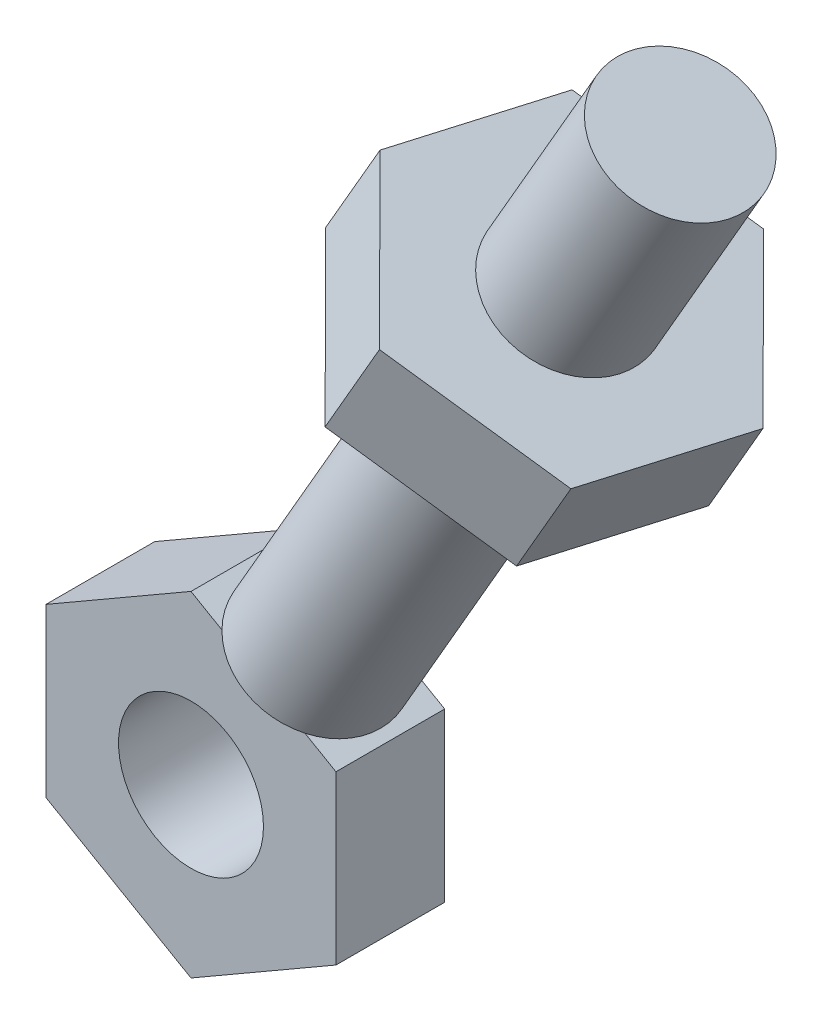
ISO-10303-21;
HEADER;
FILE_DESCRIPTION(('STEP AP214'),'2;1');
FILE_NAME('part.step','',(''),(''),'','','');
FILE_SCHEMA(('AUTOMOTIVE_DESIGN { 1 0 10303 214 1 1 1 1 }'));
ENDSEC;
DATA;
#1=APPLICATION_CONTEXT('core data for automotive mechanical design processes');
#2=APPLICATION_PROTOCOL_DEFINITION('international standard','automotive_design',2000,#1);
#3=PRODUCT_CONTEXT('',#1,'mechanical');
#4=PRODUCT('Part','Part','',(#3));
#5=PRODUCT_RELATED_PRODUCT_CATEGORY('part','',(#4));
#6=PRODUCT_DEFINITION_FORMATION('','',#4);
#7=PRODUCT_DEFINITION_CONTEXT('part definition',#1,'design');
#8=PRODUCT_DEFINITION('design','',#6,#7);
#9=PRODUCT_DEFINITION_SHAPE('','',#8);
#10=(LENGTH_UNIT() NAMED_UNIT(*) SI_UNIT(.MILLI.,.METRE.));
#11=(NAMED_UNIT(*) PLANE_ANGLE_UNIT() SI_UNIT($,.RADIAN.));
#12=(NAMED_UNIT(*) SI_UNIT($,.STERADIAN.) SOLID_ANGLE_UNIT());
#13=UNCERTAINTY_MEASURE_WITH_UNIT(LENGTH_MEASURE(1.E-05),#10,'distance_accuracy_value','');
#14=(GEOMETRIC_REPRESENTATION_CONTEXT(3) GLOBAL_UNCERTAINTY_ASSIGNED_CONTEXT((#13)) GLOBAL_UNIT_ASSIGNED_CONTEXT((#10,
#11,#12)) REPRESENTATION_CONTEXT('',''));
#15=CARTESIAN_POINT('',(0.,0.,0.));
#16=DIRECTION('',(0.,0.,1.));
#17=DIRECTION('',(1.,0.,0.));
#18=AXIS2_PLACEMENT_3D('',#15,#16,#17);
#19=CARTESIAN_POINT('',(12.,20.7846096908265,1.5));
#20=DIRECTION('',(-0.5,-0.866025403784439,0.));
#21=DIRECTION('',(0.866025403784439,-0.5,0.));
#22=AXIS2_PLACEMENT_3D('',#19,#20,#21);
#23=CYLINDRICAL_SURFACE('',#22,2.);
#24=CARTESIAN_POINT('',(2.,3.46410161513775,1.5));
#25=DIRECTION('',(0.5,0.866025403784439,0.));
#26=DIRECTION('',(-0.866025403784439,0.5,0.));
#27=AXIS2_PLACEMENT_3D('',#24,#25,#26);
#28=CIRCLE('',#27,2.);
#29=CARTESIAN_POINT('',(0.854356076261039,4.1255394429039,3.));
#30=VERTEX_POINT('',#29);
#31=CARTESIAN_POINT('',(3.14564392373896,2.80266378737161,3.));
#32=VERTEX_POINT('',#31);
#33=EDGE_CURVE('E175',#30,#32,#28,.T.);
#34=ORIENTED_EDGE('',*,*,#33,.T.);
#35=CARTESIAN_POINT('',(3.14564392373896,2.80266378737161,0.));
#36=VERTEX_POINT('',#35);
#37=EDGE_CURVE('E43',#32,#36,#28,.T.);
#38=ORIENTED_EDGE('',*,*,#37,.T.);
#39=CARTESIAN_POINT('',(0.85435607626104,4.1255394429039,0.));
#40=VERTEX_POINT('',#39);
#41=EDGE_CURVE('E166',#36,#40,#28,.T.);
#42=ORIENTED_EDGE('',*,*,#41,.T.);
#43=EDGE_CURVE('E57',#40,#30,#28,.T.);
#44=ORIENTED_EDGE('',*,*,#43,.T.);
#45=EDGE_LOOP('',(#34,#38,#42,#44));
#46=FACE_BOUND('',#45,.T.);
#47=CARTESIAN_POINT('',(7.5,12.9903810567666,1.5));
#48=DIRECTION('',(0.5,0.866025403784439,0.));
#49=DIRECTION('',(-0.866025403784439,0.5,0.));
#50=AXIS2_PLACEMENT_3D('',#47,#48,#49);
#51=CIRCLE('',#50,2.);
#52=CARTESIAN_POINT('',(5.76794919243112,13.9903810567666,1.5));
#53=VERTEX_POINT('',#52);
#54=EDGE_CURVE('E11',#53,#53,#51,.T.);
#55=ORIENTED_EDGE('',*,*,#54,.F.);
#56=EDGE_LOOP('',(#55));
#57=FACE_BOUND('',#56,.T.);
#58=ADVANCED_FACE('F34',(#46,#57),#23,.T.);
#59=CARTESIAN_POINT('',(4.,2.3094010767585,3.));
#60=DIRECTION('',(-0.5,-0.866025403784439,0.));
#61=DIRECTION('',(0.866025403784439,-0.5,0.));
#62=AXIS2_PLACEMENT_3D('',#59,#60,#61);
#63=PLANE('',#62);
#64=ORIENTED_EDGE('',*,*,#37,.F.);
#65=DIRECTION('',(-0.866025403784439,0.5,0.));
#66=VECTOR('',#65,1.);
#67=CARTESIAN_POINT('',(4.,2.3094010767585,3.));
#68=LINE('',#67,#66);
#69=CARTESIAN_POINT('',(4.,2.3094010767585,3.));
#70=VERTEX_POINT('',#69);
#71=EDGE_CURVE('E184',#70,#32,#68,.T.);
#72=ORIENTED_EDGE('',*,*,#71,.F.);
#73=DIRECTION('',(0.,0.,-1.));
#74=VECTOR('',#73,1.);
#75=CARTESIAN_POINT('',(4.,2.3094010767585,3.));
#76=LINE('',#75,#74);
#77=CARTESIAN_POINT('',(4.,2.3094010767585,0.));
#78=VERTEX_POINT('',#77);
#79=EDGE_CURVE('E198',#70,#78,#76,.T.);
#80=ORIENTED_EDGE('',*,*,#79,.T.);
#81=DIRECTION('',(-0.866025403784439,0.5,0.));
#82=VECTOR('',#81,1.);
#83=CARTESIAN_POINT('',(4.,2.3094010767585,0.));
#84=LINE('',#83,#82);
#85=EDGE_CURVE('E199',#78,#36,#84,.T.);
#86=ORIENTED_EDGE('',*,*,#85,.T.);
#87=EDGE_LOOP('',(#64,#72,#80,#86));
#88=FACE_BOUND('',#87,.T.);
#89=ADVANCED_FACE('F36',(#88),#63,.F.);
#90=ORIENTED_EDGE('',*,*,#43,.F.);
#91=CARTESIAN_POINT('',(0.,4.61880215351701,0.));
#92=VERTEX_POINT('',#91);
#93=EDGE_CURVE('E181',#40,#92,#84,.T.);
#94=ORIENTED_EDGE('',*,*,#93,.T.);
#95=DIRECTION('',(0.,0.,-1.));
#96=VECTOR('',#95,1.);
#97=CARTESIAN_POINT('',(0.,4.61880215351701,3.));
#98=LINE('',#97,#96);
#99=CARTESIAN_POINT('',(0.,4.61880215351701,3.));
#100=VERTEX_POINT('',#99);
#101=EDGE_CURVE('E226',#100,#92,#98,.T.);
#102=ORIENTED_EDGE('',*,*,#101,.F.);
#103=EDGE_CURVE('E188',#30,#100,#68,.T.);
#104=ORIENTED_EDGE('',*,*,#103,.F.);
#105=EDGE_LOOP('',(#90,#94,#102,#104));
#106=FACE_BOUND('',#105,.T.);
#107=ADVANCED_FACE('F242',(#106),#63,.F.);
#108=CARTESIAN_POINT('',(0.,0.,3.));
#109=DIRECTION('',(0.,0.,1.));
#110=DIRECTION('',(1.,0.,0.));
#111=AXIS2_PLACEMENT_3D('',#108,#109,#110);
#112=PLANE('',#111);
#113=ORIENTED_EDGE('',*,*,#71,.T.);
#114=EDGE_CURVE('E187',#32,#30,#68,.T.);
#115=ORIENTED_EDGE('',*,*,#114,.T.);
#116=ORIENTED_EDGE('',*,*,#103,.T.);
#117=DIRECTION('',(-0.866025403784439,-0.5,0.));
#118=VECTOR('',#117,1.);
#119=CARTESIAN_POINT('',(0.,4.61880215351701,3.));
#120=LINE('',#119,#118);
#121=CARTESIAN_POINT('',(-4.,2.3094010767585,3.));
#122=VERTEX_POINT('',#121);
#123=EDGE_CURVE('E186',#100,#122,#120,.T.);
#124=ORIENTED_EDGE('',*,*,#123,.T.);
#125=DIRECTION('',(0.,-1.,0.));
#126=VECTOR('',#125,1.);
#127=CARTESIAN_POINT('',(-4.,2.3094010767585,3.));
#128=LINE('',#127,#126);
#129=CARTESIAN_POINT('',(-4.,-2.3094010767585,3.));
#130=VERTEX_POINT('',#129);
#131=EDGE_CURVE('E190',#122,#130,#128,.T.);
#132=ORIENTED_EDGE('',*,*,#131,.T.);
#133=DIRECTION('',(0.866025403784439,-0.5,0.));
#134=VECTOR('',#133,1.);
#135=CARTESIAN_POINT('',(-4.,-2.3094010767585,3.));
#136=LINE('',#135,#134);
#137=CARTESIAN_POINT('',(0.,-4.61880215351701,3.));
#138=VERTEX_POINT('',#137);
#139=EDGE_CURVE('E192',#130,#138,#136,.T.);
#140=ORIENTED_EDGE('',*,*,#139,.T.);
#141=DIRECTION('',(0.866025403784439,0.5,0.));
#142=VECTOR('',#141,1.);
#143=CARTESIAN_POINT('',(0.,-4.61880215351701,3.));
#144=LINE('',#143,#142);
#145=CARTESIAN_POINT('',(4.,-2.3094010767585,3.));
#146=VERTEX_POINT('',#145);
#147=EDGE_CURVE('E194',#138,#146,#144,.T.);
#148=ORIENTED_EDGE('',*,*,#147,.T.);
#149=DIRECTION('',(0.,1.,0.));
#150=VECTOR('',#149,1.);
#151=CARTESIAN_POINT('',(4.,-2.3094010767585,3.));
#152=LINE('',#151,#150);
#153=EDGE_CURVE('E196',#146,#70,#152,.T.);
#154=ORIENTED_EDGE('',*,*,#153,.T.);
#155=EDGE_LOOP('',(#113,#115,#116,#124,#132,#140,#148,#154));
#156=FACE_BOUND('',#155,.T.);
#157=CARTESIAN_POINT('',(0.,0.,3.));
#158=DIRECTION('',(0.,0.,1.));
#159=DIRECTION('',(1.,0.,0.));
#160=AXIS2_PLACEMENT_3D('',#157,#158,#159);
#161=CIRCLE('',#160,2.);
#162=CARTESIAN_POINT('',(2.,0.,3.));
#163=VERTEX_POINT('',#162);
#164=EDGE_CURVE('E178',#163,#163,#161,.T.);
#165=ORIENTED_EDGE('',*,*,#164,.F.);
#166=EDGE_LOOP('',(#165));
#167=FACE_BOUND('',#166,.T.);
#168=ADVANCED_FACE('F255',(#156,#167),#112,.T.);
#169=CARTESIAN_POINT('',(0.,0.,0.));
#170=DIRECTION('',(0.,0.,1.));
#171=DIRECTION('',(1.,0.,0.));
#172=AXIS2_PLACEMENT_3D('',#169,#170,#171);
#173=PLANE('',#172);
#174=ORIENTED_EDGE('',*,*,#85,.F.);
#175=DIRECTION('',(0.,1.,0.));
#176=VECTOR('',#175,1.);
#177=CARTESIAN_POINT('',(4.,-2.3094010767585,0.));
#178=LINE('',#177,#176);
#179=CARTESIAN_POINT('',(4.,-2.3094010767585,0.));
#180=VERTEX_POINT('',#179);
#181=EDGE_CURVE('E210',#180,#78,#178,.T.);
#182=ORIENTED_EDGE('',*,*,#181,.F.);
#183=DIRECTION('',(0.866025403784439,0.5,0.));
#184=VECTOR('',#183,1.);
#185=CARTESIAN_POINT('',(0.,-4.61880215351701,0.));
#186=LINE('',#185,#184);
#187=CARTESIAN_POINT('',(0.,-4.61880215351701,0.));
#188=VERTEX_POINT('',#187);
#189=EDGE_CURVE('E208',#188,#180,#186,.T.);
#190=ORIENTED_EDGE('',*,*,#189,.F.);
#191=DIRECTION('',(0.866025403784439,-0.5,0.));
#192=VECTOR('',#191,1.);
#193=CARTESIAN_POINT('',(-4.,-2.3094010767585,0.));
#194=LINE('',#193,#192);
#195=CARTESIAN_POINT('',(-4.,-2.3094010767585,0.));
#196=VERTEX_POINT('',#195);
#197=EDGE_CURVE('E206',#196,#188,#194,.T.);
#198=ORIENTED_EDGE('',*,*,#197,.F.);
#199=DIRECTION('',(0.,-1.,0.));
#200=VECTOR('',#199,1.);
#201=CARTESIAN_POINT('',(-4.,2.3094010767585,0.));
#202=LINE('',#201,#200);
#203=CARTESIAN_POINT('',(-4.,2.3094010767585,0.));
#204=VERTEX_POINT('',#203);
#205=EDGE_CURVE('E204',#204,#196,#202,.T.);
#206=ORIENTED_EDGE('',*,*,#205,.F.);
#207=DIRECTION('',(-0.866025403784439,-0.5,0.));
#208=VECTOR('',#207,1.);
#209=CARTESIAN_POINT('',(0.,4.61880215351701,0.));
#210=LINE('',#209,#208);
#211=EDGE_CURVE('E201',#92,#204,#210,.T.);
#212=ORIENTED_EDGE('',*,*,#211,.F.);
#213=ORIENTED_EDGE('',*,*,#93,.F.);
#214=EDGE_CURVE('E202',#36,#40,#84,.T.);
#215=ORIENTED_EDGE('',*,*,#214,.F.);
#216=EDGE_LOOP('',(#174,#182,#190,#198,#206,#212,#213,#215));
#217=FACE_BOUND('',#216,.T.);
#218=CARTESIAN_POINT('',(0.,0.,0.));
#219=DIRECTION('',(0.,0.,1.));
#220=DIRECTION('',(1.,0.,0.));
#221=AXIS2_PLACEMENT_3D('',#218,#219,#220);
#222=CIRCLE('',#221,2.);
#223=CARTESIAN_POINT('',(2.,0.,0.));
#224=VERTEX_POINT('',#223);
#225=EDGE_CURVE('E174',#224,#224,#222,.T.);
#226=ORIENTED_EDGE('',*,*,#225,.T.);
#227=EDGE_LOOP('',(#226));
#228=FACE_BOUND('',#227,.T.);
#229=ADVANCED_FACE('F244',(#217,#228),#173,.F.);
#230=CARTESIAN_POINT('',(0.,4.61880215351701,3.));
#231=DIRECTION('',(0.5,-0.866025403784438,0.));
#232=DIRECTION('',(0.866025403784439,0.5,0.));
#233=AXIS2_PLACEMENT_3D('',#230,#231,#232);
#234=PLANE('',#233);
#235=ORIENTED_EDGE('',*,*,#211,.T.);
#236=DIRECTION('',(0.,0.,-1.));
#237=VECTOR('',#236,1.);
#238=CARTESIAN_POINT('',(-4.,2.3094010767585,3.));
#239=LINE('',#238,#237);
#240=EDGE_CURVE('E223',#122,#204,#239,.T.);
#241=ORIENTED_EDGE('',*,*,#240,.F.);
#242=ORIENTED_EDGE('',*,*,#123,.F.);
#243=ORIENTED_EDGE('',*,*,#101,.T.);
#244=EDGE_LOOP('',(#235,#241,#242,#243));
#245=FACE_BOUND('',#244,.T.);
#246=ADVANCED_FACE('F248',(#245),#234,.F.);
#247=CARTESIAN_POINT('',(-4.,2.3094010767585,3.));
#248=DIRECTION('',(1.,0.,0.));
#249=DIRECTION('',(0.,0.,-1.));
#250=AXIS2_PLACEMENT_3D('',#247,#248,#249);
#251=PLANE('',#250);
#252=ORIENTED_EDGE('',*,*,#205,.T.);
#253=DIRECTION('',(0.,0.,-1.));
#254=VECTOR('',#253,1.);
#255=CARTESIAN_POINT('',(-4.,-2.3094010767585,3.));
#256=LINE('',#255,#254);
#257=EDGE_CURVE('E220',#130,#196,#256,.T.);
#258=ORIENTED_EDGE('',*,*,#257,.F.);
#259=ORIENTED_EDGE('',*,*,#131,.F.);
#260=ORIENTED_EDGE('',*,*,#240,.T.);
#261=EDGE_LOOP('',(#252,#258,#259,#260));
#262=FACE_BOUND('',#261,.T.);
#263=ADVANCED_FACE('F251',(#262),#251,.F.);
#264=CARTESIAN_POINT('',(-4.,-2.3094010767585,3.));
#265=DIRECTION('',(0.5,0.866025403784438,0.));
#266=DIRECTION('',(-0.866025403784439,0.5,0.));
#267=AXIS2_PLACEMENT_3D('',#264,#265,#266);
#268=PLANE('',#267);
#269=ORIENTED_EDGE('',*,*,#197,.T.);
#270=DIRECTION('',(0.,0.,-1.));
#271=VECTOR('',#270,1.);
#272=CARTESIAN_POINT('',(0.,-4.61880215351701,3.));
#273=LINE('',#272,#271);
#274=EDGE_CURVE('E217',#138,#188,#273,.T.);
#275=ORIENTED_EDGE('',*,*,#274,.F.);
#276=ORIENTED_EDGE('',*,*,#139,.F.);
#277=ORIENTED_EDGE('',*,*,#257,.T.);
#278=EDGE_LOOP('',(#269,#275,#276,#277));
#279=FACE_BOUND('',#278,.T.);
#280=ADVANCED_FACE('F474',(#279),#268,.F.);
#281=CARTESIAN_POINT('',(0.,-4.61880215351701,3.));
#282=DIRECTION('',(-0.5,0.866025403784439,0.));
#283=DIRECTION('',(-0.866025403784439,-0.5,0.));
#284=AXIS2_PLACEMENT_3D('',#281,#282,#283);
#285=PLANE('',#284);
#286=ORIENTED_EDGE('',*,*,#189,.T.);
#287=DIRECTION('',(0.,0.,-1.));
#288=VECTOR('',#287,1.);
#289=CARTESIAN_POINT('',(4.,-2.3094010767585,3.));
#290=LINE('',#289,#288);
#291=EDGE_CURVE('E214',#146,#180,#290,.T.);
#292=ORIENTED_EDGE('',*,*,#291,.F.);
#293=ORIENTED_EDGE('',*,*,#147,.F.);
#294=ORIENTED_EDGE('',*,*,#274,.T.);
#295=EDGE_LOOP('',(#286,#292,#293,#294));
#296=FACE_BOUND('',#295,.T.);
#297=ADVANCED_FACE('F464',(#296),#285,.F.);
#298=CARTESIAN_POINT('',(4.,-2.3094010767585,3.));
#299=DIRECTION('',(-1.,0.,0.));
#300=DIRECTION('',(0.,-1.,0.));
#301=AXIS2_PLACEMENT_3D('',#298,#299,#300);
#302=PLANE('',#301);
#303=ORIENTED_EDGE('',*,*,#181,.T.);
#304=ORIENTED_EDGE('',*,*,#79,.F.);
#305=ORIENTED_EDGE('',*,*,#153,.F.);
#306=ORIENTED_EDGE('',*,*,#291,.T.);
#307=EDGE_LOOP('',(#303,#304,#305,#306));
#308=FACE_BOUND('',#307,.T.);
#309=ADVANCED_FACE('F455',(#308),#302,.F.);
#310=CARTESIAN_POINT('',(0.,0.,3.));
#311=DIRECTION('',(0.,0.,-1.));
#312=DIRECTION('',(-1.,0.,0.));
#313=AXIS2_PLACEMENT_3D('',#310,#311,#312);
#314=CYLINDRICAL_SURFACE('',#313,2.);
#315=ORIENTED_EDGE('',*,*,#164,.T.);
#316=EDGE_LOOP('',(#315));
#317=FACE_BOUND('',#316,.T.);
#318=ORIENTED_EDGE('',*,*,#225,.F.);
#319=EDGE_LOOP('',(#318));
#320=FACE_BOUND('',#319,.T.);
#321=ADVANCED_FACE('F269',(#317,#320),#314,.F.);
#322=CARTESIAN_POINT('',(2.,3.46410161513775,1.5));
#323=DIRECTION('',(0.5,0.866025403784439,0.));
#324=DIRECTION('',(-0.866025403784439,0.5,0.));
#325=AXIS2_PLACEMENT_3D('',#322,#323,#324);
#326=PLANE('',#325);
#327=ORIENTED_EDGE('',*,*,#41,.F.);
#328=ORIENTED_EDGE('',*,*,#214,.T.);
#329=EDGE_LOOP('',(#327,#328));
#330=FACE_BOUND('',#329,.T.);
#331=ADVANCED_FACE('F238',(#330),#326,.F.);
#332=ORIENTED_EDGE('',*,*,#114,.F.);
#333=ORIENTED_EDGE('',*,*,#33,.F.);
#334=EDGE_LOOP('',(#332,#333));
#335=FACE_BOUND('',#334,.T.);
#336=ADVANCED_FACE('F260',(#335),#326,.F.);
#337=CARTESIAN_POINT('',(9.,15.5884572681199,0.));
#338=DIRECTION('',(0.5,0.866025403784439,0.));
#339=DIRECTION('',(-0.866025403784439,0.5,0.));
#340=AXIS2_PLACEMENT_3D('',#337,#338,#339);
#341=PLANE('',#340);
#342=DIRECTION('',(-0.653098392865681,0.377066532928313,-0.656721644977297));
#343=VECTOR('',#342,1.);
#344=CARTESIAN_POINT('',(12.783216642775,13.4042161210111,0.000101410614679917));
#345=LINE('',#344,#343);
#346=CARTESIAN_POINT('',(12.783216642775,13.4042161210111,0.000101410614679917));
#347=VERTEX_POINT('',#346);
#348=CARTESIAN_POINT('',(9.76668437934852,15.1458118353195,-3.03316593746769));
#349=VERTEX_POINT('',#348);
#350=EDGE_CURVE('E149',#347,#349,#345,.T.);
#351=ORIENTED_EDGE('',*,*,#350,.T.);
#352=DIRECTION('',(-0.819090430165813,0.472902080346878,0.324737570377033));
#353=VECTOR('',#352,1.);
#354=CARTESIAN_POINT('',(9.76668437934852,15.1458118353195,-3.03316593746769));
#355=LINE('',#354,#353);
#356=CARTESIAN_POINT('',(5.98346773657349,17.3300529824284,-1.53326734808237));
#357=VERTEX_POINT('',#356);
#358=EDGE_CURVE('E138',#349,#357,#355,.T.);
#359=ORIENTED_EDGE('',*,*,#358,.T.);
#360=DIRECTION('',(-0.165992037300132,0.0958355474185655,0.981459215354329));
#361=VECTOR('',#360,1.);
#362=CARTESIAN_POINT('',(5.98346773657349,17.3300529824284,-1.53326734808237));
#363=LINE('',#362,#361);
#364=CARTESIAN_POINT('',(5.21678335722497,17.7726984152287,2.99989858938532));
#365=VERTEX_POINT('',#364);
#366=EDGE_CURVE('E148',#357,#365,#363,.T.);
#367=ORIENTED_EDGE('',*,*,#366,.T.);
#368=DIRECTION('',(0.653098392865681,-0.377066532928313,0.656721644977297));
#369=VECTOR('',#368,1.);
#370=CARTESIAN_POINT('',(5.21678335722497,17.7726984152287,2.99989858938532));
#371=LINE('',#370,#369);
#372=CARTESIAN_POINT('',(8.23331562065147,16.0311027009202,6.03316593746769));
#373=VERTEX_POINT('',#372);
#374=EDGE_CURVE('E345',#365,#373,#371,.T.);
#375=ORIENTED_EDGE('',*,*,#374,.T.);
#376=DIRECTION('',(0.819090430165813,-0.472902080346878,-0.324737570377033));
#377=VECTOR('',#376,1.);
#378=CARTESIAN_POINT('',(8.23331562065147,16.0311027009202,6.03316593746769));
#379=LINE('',#378,#377);
#380=CARTESIAN_POINT('',(12.0165322634265,13.8468615538114,4.53326734808237));
#381=VERTEX_POINT('',#380);
#382=EDGE_CURVE('E348',#373,#381,#379,.T.);
#383=ORIENTED_EDGE('',*,*,#382,.T.);
#384=DIRECTION('',(0.165992037300132,-0.0958355474185658,-0.981459215354329));
#385=VECTOR('',#384,1.);
#386=CARTESIAN_POINT('',(12.0165322634265,13.8468615538114,4.53326734808237));
#387=LINE('',#386,#385);
#388=EDGE_CURVE('E155',#381,#347,#387,.T.);
#389=ORIENTED_EDGE('',*,*,#388,.T.);
#390=EDGE_LOOP('',(#351,#359,#367,#375,#383,#389));
#391=FACE_BOUND('',#390,.T.);
#392=CARTESIAN_POINT('',(9.,15.5884572681199,1.5));
#393=DIRECTION('',(0.5,0.866025403784439,0.));
#394=DIRECTION('',(-0.866025403784439,0.5,0.));
#395=AXIS2_PLACEMENT_3D('',#392,#393,#394);
#396=CIRCLE('',#395,2.);
#397=CARTESIAN_POINT('',(7.26794919243112,16.5884572681199,1.5));
#398=VERTEX_POINT('',#397);
#399=EDGE_CURVE('E38',#398,#398,#396,.T.);
#400=ORIENTED_EDGE('',*,*,#399,.F.);
#401=EDGE_LOOP('',(#400));
#402=FACE_BOUND('',#401,.T.);
#403=ADVANCED_FACE('F152',(#391,#402),#341,.T.);
#404=CARTESIAN_POINT('',(7.5,12.9903810567666,0.));
#405=DIRECTION('',(0.5,0.866025403784439,0.));
#406=DIRECTION('',(-0.866025403784439,0.5,0.));
#407=AXIS2_PLACEMENT_3D('',#404,#405,#406);
#408=PLANE('',#407);
#409=DIRECTION('',(-0.653098392865681,0.377066532928313,-0.656721644977297));
#410=VECTOR('',#409,1.);
#411=CARTESIAN_POINT('',(11.283216642775,10.8061399096577,0.000101410614679917));
#412=LINE('',#411,#410);
#413=CARTESIAN_POINT('',(11.283216642775,10.8061399096577,0.000101410614679917));
#414=VERTEX_POINT('',#413);
#415=CARTESIAN_POINT('',(8.26668437934852,12.5477356239662,-3.03316593746769));
#416=VERTEX_POINT('',#415);
#417=EDGE_CURVE('E163',#414,#416,#412,.T.);
#418=ORIENTED_EDGE('',*,*,#417,.F.);
#419=DIRECTION('',(0.165992037300132,-0.0958355474185658,-0.981459215354329));
#420=VECTOR('',#419,1.);
#421=CARTESIAN_POINT('',(10.5165322634265,11.2487853424581,4.53326734808237));
#422=LINE('',#421,#420);
#423=CARTESIAN_POINT('',(10.5165322634265,11.2487853424581,4.53326734808237));
#424=VERTEX_POINT('',#423);
#425=EDGE_CURVE('E159',#424,#414,#422,.T.);
#426=ORIENTED_EDGE('',*,*,#425,.F.);
#427=DIRECTION('',(0.819090430165813,-0.472902080346878,-0.324737570377033));
#428=VECTOR('',#427,1.);
#429=CARTESIAN_POINT('',(6.73331562065147,13.4330264895669,6.03316593746769));
#430=LINE('',#429,#428);
#431=CARTESIAN_POINT('',(6.73331562065147,13.4330264895669,6.03316593746769));
#432=VERTEX_POINT('',#431);
#433=EDGE_CURVE('E330',#432,#424,#430,.T.);
#434=ORIENTED_EDGE('',*,*,#433,.F.);
#435=DIRECTION('',(0.653098392865681,-0.377066532928313,0.656721644977297));
#436=VECTOR('',#435,1.);
#437=CARTESIAN_POINT('',(3.71678335722497,15.1746222038754,2.99989858938532));
#438=LINE('',#437,#436);
#439=CARTESIAN_POINT('',(3.71678335722497,15.1746222038754,2.99989858938532));
#440=VERTEX_POINT('',#439);
#441=EDGE_CURVE('E328',#440,#432,#438,.T.);
#442=ORIENTED_EDGE('',*,*,#441,.F.);
#443=DIRECTION('',(-0.165992037300132,0.0958355474185655,0.981459215354329));
#444=VECTOR('',#443,1.);
#445=CARTESIAN_POINT('',(4.48346773657349,14.7319767710751,-1.53326734808237));
#446=LINE('',#445,#444);
#447=CARTESIAN_POINT('',(4.48346773657349,14.7319767710751,-1.53326734808237));
#448=VERTEX_POINT('',#447);
#449=EDGE_CURVE('E322',#448,#440,#446,.T.);
#450=ORIENTED_EDGE('',*,*,#449,.F.);
#451=DIRECTION('',(-0.819090430165813,0.472902080346878,0.324737570377033));
#452=VECTOR('',#451,1.);
#453=CARTESIAN_POINT('',(8.26668437934852,12.5477356239662,-3.03316593746769));
#454=LINE('',#453,#452);
#455=EDGE_CURVE('E320',#416,#448,#454,.T.);
#456=ORIENTED_EDGE('',*,*,#455,.F.);
#457=EDGE_LOOP('',(#418,#426,#434,#442,#450,#456));
#458=FACE_BOUND('',#457,.T.);
#459=ORIENTED_EDGE('',*,*,#54,.T.);
#460=EDGE_LOOP('',(#459));
#461=FACE_BOUND('',#460,.T.);
#462=ADVANCED_FACE('F267',(#458,#461),#408,.F.);
#463=CARTESIAN_POINT('',(12.783216642775,13.4042161210111,0.000101410614679917));
#464=DIRECTION('',(-0.568737627765444,0.328360822488648,0.754133065856626));
#465=DIRECTION('',(0.798402601898106,0.,0.602123978331983));
#466=AXIS2_PLACEMENT_3D('',#463,#464,#465);
#467=PLANE('',#466);
#468=ORIENTED_EDGE('',*,*,#417,.T.);
#469=DIRECTION('',(-0.5,-0.866025403784439,0.));
#470=VECTOR('',#469,1.);
#471=CARTESIAN_POINT('',(9.76668437934852,15.1458118353195,-3.03316593746769));
#472=LINE('',#471,#470);
#473=EDGE_CURVE('E142',#349,#416,#472,.T.);
#474=ORIENTED_EDGE('',*,*,#473,.F.);
#475=ORIENTED_EDGE('',*,*,#350,.F.);
#476=DIRECTION('',(-0.5,-0.866025403784439,0.));
#477=VECTOR('',#476,1.);
#478=CARTESIAN_POINT('',(12.783216642775,13.4042161210111,0.000101410614679917));
#479=LINE('',#478,#477);
#480=EDGE_CURVE('E333',#347,#414,#479,.T.);
#481=ORIENTED_EDGE('',*,*,#480,.T.);
#482=EDGE_LOOP('',(#468,#474,#475,#481));
#483=FACE_BOUND('',#482,.T.);
#484=ADVANCED_FACE('F161',(#483),#467,.F.);
#485=CARTESIAN_POINT('',(9.76668437934852,15.1458118353195,-3.03316593746769));
#486=DIRECTION('',(0.281230985509747,-0.162368785188516,0.945804160693757));
#487=DIRECTION('',(0.958523630998031,0.,-0.285013067802776));
#488=AXIS2_PLACEMENT_3D('',#485,#486,#487);
#489=PLANE('',#488);
#490=ORIENTED_EDGE('',*,*,#455,.T.);
#491=DIRECTION('',(-0.5,-0.866025403784439,0.));
#492=VECTOR('',#491,1.);
#493=CARTESIAN_POINT('',(5.98346773657349,17.3300529824284,-1.53326734808237));
#494=LINE('',#493,#492);
#495=EDGE_CURVE('E145',#357,#448,#494,.T.);
#496=ORIENTED_EDGE('',*,*,#495,.F.);
#497=ORIENTED_EDGE('',*,*,#358,.F.);
#498=ORIENTED_EDGE('',*,*,#473,.T.);
#499=EDGE_LOOP('',(#490,#496,#497,#498));
#500=FACE_BOUND('',#499,.T.);
#501=ADVANCED_FACE('F140',(#500),#489,.F.);
#502=CARTESIAN_POINT('',(5.98346773657349,17.3300529824284,-1.53326734808237));
#503=DIRECTION('',(0.849968613275191,-0.490729607677165,0.191671094837131));
#504=DIRECTION('',(0.5,0.866025403784439,0.));
#505=AXIS2_PLACEMENT_3D('',#502,#503,#504);
#506=PLANE('',#505);
#507=ORIENTED_EDGE('',*,*,#449,.T.);
#508=DIRECTION('',(-0.5,-0.866025403784439,0.));
#509=VECTOR('',#508,1.);
#510=CARTESIAN_POINT('',(5.21678335722497,17.7726984152287,2.99989858938532));
#511=LINE('',#510,#509);
#512=EDGE_CURVE('E167',#365,#440,#511,.T.);
#513=ORIENTED_EDGE('',*,*,#512,.F.);
#514=ORIENTED_EDGE('',*,*,#366,.F.);
#515=ORIENTED_EDGE('',*,*,#495,.T.);
#516=EDGE_LOOP('',(#507,#513,#514,#515));
#517=FACE_BOUND('',#516,.T.);
#518=ADVANCED_FACE('F300',(#517),#506,.F.);
#519=CARTESIAN_POINT('',(5.21678335722497,17.7726984152287,2.99989858938532));
#520=DIRECTION('',(0.568737627765444,-0.328360822488648,-0.754133065856625));
#521=DIRECTION('',(-0.798402601898106,0.,-0.602123978331983));
#522=AXIS2_PLACEMENT_3D('',#519,#520,#521);
#523=PLANE('',#522);
#524=ORIENTED_EDGE('',*,*,#441,.T.);
#525=DIRECTION('',(-0.5,-0.866025403784439,0.));
#526=VECTOR('',#525,1.);
#527=CARTESIAN_POINT('',(8.23331562065147,16.0311027009202,6.03316593746769));
#528=LINE('',#527,#526);
#529=EDGE_CURVE('E338',#373,#432,#528,.T.);
#530=ORIENTED_EDGE('',*,*,#529,.F.);
#531=ORIENTED_EDGE('',*,*,#374,.F.);
#532=ORIENTED_EDGE('',*,*,#512,.T.);
#533=EDGE_LOOP('',(#524,#530,#531,#532));
#534=FACE_BOUND('',#533,.T.);
#535=ADVANCED_FACE('F303',(#534),#523,.F.);
#536=CARTESIAN_POINT('',(8.23331562065147,16.0311027009202,6.03316593746769));
#537=DIRECTION('',(-0.281230985509747,0.162368785188516,-0.945804160693757));
#538=DIRECTION('',(-0.958523630998031,0.,0.285013067802776));
#539=AXIS2_PLACEMENT_3D('',#536,#537,#538);
#540=PLANE('',#539);
#541=ORIENTED_EDGE('',*,*,#433,.T.);
#542=DIRECTION('',(-0.5,-0.866025403784439,0.));
#543=VECTOR('',#542,1.);
#544=CARTESIAN_POINT('',(12.0165322634265,13.8468615538114,4.53326734808237));
#545=LINE('',#544,#543);
#546=EDGE_CURVE('E335',#381,#424,#545,.T.);
#547=ORIENTED_EDGE('',*,*,#546,.F.);
#548=ORIENTED_EDGE('',*,*,#382,.F.);
#549=ORIENTED_EDGE('',*,*,#529,.T.);
#550=EDGE_LOOP('',(#541,#547,#548,#549));
#551=FACE_BOUND('',#550,.T.);
#552=ADVANCED_FACE('F292',(#551),#540,.F.);
#553=CARTESIAN_POINT('',(12.0165322634265,13.8468615538114,4.53326734808237));
#554=DIRECTION('',(-0.849968613275191,0.490729607677165,-0.191671094837132));
#555=DIRECTION('',(-0.5,-0.866025403784439,0.));
#556=AXIS2_PLACEMENT_3D('',#553,#554,#555);
#557=PLANE('',#556);
#558=ORIENTED_EDGE('',*,*,#425,.T.);
#559=ORIENTED_EDGE('',*,*,#480,.F.);
#560=ORIENTED_EDGE('',*,*,#388,.F.);
#561=ORIENTED_EDGE('',*,*,#546,.T.);
#562=EDGE_LOOP('',(#558,#559,#560,#561));
#563=FACE_BOUND('',#562,.T.);
#564=ADVANCED_FACE('F284',(#563),#557,.F.);
#565=CARTESIAN_POINT('',(12.,20.7846096908265,1.5));
#566=DIRECTION('',(0.5,0.866025403784439,0.));
#567=DIRECTION('',(-0.866025403784439,0.5,0.));
#568=AXIS2_PLACEMENT_3D('',#565,#566,#567);
#569=PLANE('',#568);
#570=CARTESIAN_POINT('',(12.,20.7846096908265,1.5));
#571=DIRECTION('',(0.5,0.866025403784439,0.));
#572=DIRECTION('',(-0.866025403784439,0.5,0.));
#573=AXIS2_PLACEMENT_3D('',#570,#571,#572);
#574=CIRCLE('',#573,2.);
#575=CARTESIAN_POINT('',(10.2679491924311,21.7846096908265,1.5));
#576=VERTEX_POINT('',#575);
#577=EDGE_CURVE('E171',#576,#576,#574,.T.);
#578=ORIENTED_EDGE('',*,*,#577,.T.);
#579=EDGE_LOOP('',(#578));
#580=FACE_BOUND('',#579,.T.);
#581=ADVANCED_FACE('F279',(#580),#569,.T.);
#582=ORIENTED_EDGE('',*,*,#399,.T.);
#583=EDGE_LOOP('',(#582));
#584=FACE_BOUND('',#583,.T.);
#585=ORIENTED_EDGE('',*,*,#577,.F.);
#586=EDGE_LOOP('',(#585));
#587=FACE_BOUND('',#586,.T.);
#588=ADVANCED_FACE('F273',(#584,#587),#23,.T.);
#589=CLOSED_SHELL('',(#58,#89,#107,#168,#229,#246,#263,#280,#297,#309,#321,#331,#336,#403,#462,
#484,#501,#518,#535,#552,#564,#581,#588));
#590=MANIFOLD_SOLID_BREP('B2',#589);
#591=ADVANCED_BREP_SHAPE_REPRESENTATION('',(#18,#590),#14);
#592=SHAPE_DEFINITION_REPRESENTATION(#9,#591);
ENDSEC;
END-ISO-10303-21;
